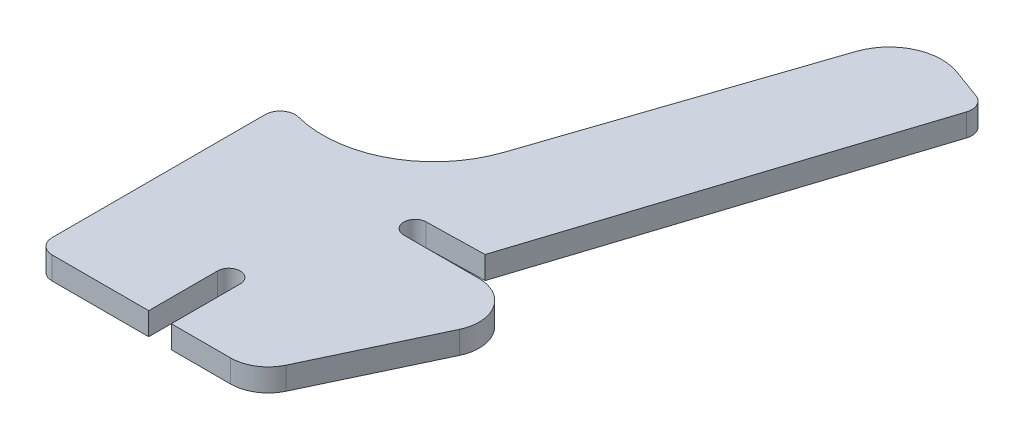
ISO-10303-21;
HEADER;
FILE_DESCRIPTION(('STEP AP214'),'2;1');
FILE_NAME('part.step','',(''),(''),'','','');
FILE_SCHEMA(('AUTOMOTIVE_DESIGN { 1 0 10303 214 1 1 1 1 }'));
ENDSEC;
DATA;
#1=APPLICATION_CONTEXT('core data for automotive mechanical design processes');
#2=APPLICATION_PROTOCOL_DEFINITION('international standard','automotive_design',2000,#1);
#3=PRODUCT_CONTEXT('',#1,'mechanical');
#4=PRODUCT('Part','Part','',(#3));
#5=PRODUCT_RELATED_PRODUCT_CATEGORY('part','',(#4));
#6=PRODUCT_DEFINITION_FORMATION('','',#4);
#7=PRODUCT_DEFINITION_CONTEXT('part definition',#1,'design');
#8=PRODUCT_DEFINITION('design','',#6,#7);
#9=PRODUCT_DEFINITION_SHAPE('','',#8);
#10=(LENGTH_UNIT() NAMED_UNIT(*) SI_UNIT(.MILLI.,.METRE.));
#11=(NAMED_UNIT(*) PLANE_ANGLE_UNIT() SI_UNIT($,.RADIAN.));
#12=(NAMED_UNIT(*) SI_UNIT($,.STERADIAN.) SOLID_ANGLE_UNIT());
#13=UNCERTAINTY_MEASURE_WITH_UNIT(LENGTH_MEASURE(1.E-05),#10,'distance_accuracy_value','');
#14=(GEOMETRIC_REPRESENTATION_CONTEXT(3) GLOBAL_UNCERTAINTY_ASSIGNED_CONTEXT((#13)) GLOBAL_UNIT_ASSIGNED_CONTEXT((#10,
#11,#12)) REPRESENTATION_CONTEXT('',''));
#15=CARTESIAN_POINT('',(0.,0.,0.));
#16=DIRECTION('',(0.,0.,1.));
#17=DIRECTION('',(1.,0.,0.));
#18=AXIS2_PLACEMENT_3D('',#15,#16,#17);
#19=CARTESIAN_POINT('',(0.,3.,0.));
#20=DIRECTION('',(0.,0.,-1.));
#21=DIRECTION('',(-1.,0.,0.));
#22=AXIS2_PLACEMENT_3D('',#19,#20,#21);
#23=PLANE('',#22);
#24=DIRECTION('',(1.,0.,0.));
#25=VECTOR('',#24,1.);
#26=CARTESIAN_POINT('',(0.,3.,0.));
#27=LINE('',#26,#25);
#28=CARTESIAN_POINT('',(2.,3.,0.));
#29=VERTEX_POINT('',#28);
#30=CARTESIAN_POINT('',(14.8,3.,0.));
#31=VERTEX_POINT('',#30);
#32=EDGE_CURVE('E169',#29,#31,#27,.T.);
#33=ORIENTED_EDGE('',*,*,#32,.F.);
#34=DIRECTION('',(0.,-1.,0.));
#35=VECTOR('',#34,1.);
#36=CARTESIAN_POINT('',(2.,3.,0.));
#37=LINE('',#36,#35);
#38=CARTESIAN_POINT('',(2.,0.,0.));
#39=VERTEX_POINT('',#38);
#40=EDGE_CURVE('E231',#29,#39,#37,.T.);
#41=ORIENTED_EDGE('',*,*,#40,.T.);
#42=DIRECTION('',(1.,0.,0.));
#43=VECTOR('',#42,1.);
#44=CARTESIAN_POINT('',(0.,0.,0.));
#45=LINE('',#44,#43);
#46=CARTESIAN_POINT('',(14.8,0.,0.));
#47=VERTEX_POINT('',#46);
#48=EDGE_CURVE('E193',#39,#47,#45,.T.);
#49=ORIENTED_EDGE('',*,*,#48,.T.);
#50=DIRECTION('',(0.,-1.,0.));
#51=VECTOR('',#50,1.);
#52=CARTESIAN_POINT('',(14.8,3.,0.));
#53=LINE('',#52,#51);
#54=EDGE_CURVE('E186',#31,#47,#53,.T.);
#55=ORIENTED_EDGE('',*,*,#54,.F.);
#56=EDGE_LOOP('',(#33,#41,#49,#55));
#57=FACE_BOUND('',#56,.T.);
#58=ADVANCED_FACE('F33',(#57),#23,.F.);
#59=CARTESIAN_POINT('',(14.8,3.,0.));
#60=DIRECTION('',(-1.,0.,0.));
#61=DIRECTION('',(0.,0.,1.));
#62=AXIS2_PLACEMENT_3D('',#59,#60,#61);
#63=PLANE('',#62);
#64=DIRECTION('',(0.,0.,-1.));
#65=VECTOR('',#64,1.);
#66=CARTESIAN_POINT('',(14.8,0.,0.));
#67=LINE('',#66,#65);
#68=CARTESIAN_POINT('',(14.8,0.,-9.13));
#69=VERTEX_POINT('',#68);
#70=EDGE_CURVE('E311',#47,#69,#67,.T.);
#71=ORIENTED_EDGE('',*,*,#70,.T.);
#72=DIRECTION('',(0.,-1.,0.));
#73=VECTOR('',#72,1.);
#74=CARTESIAN_POINT('',(14.8,3.,-9.13));
#75=LINE('',#74,#73);
#76=CARTESIAN_POINT('',(14.8,3.,-9.13));
#77=VERTEX_POINT('',#76);
#78=EDGE_CURVE('E188',#77,#69,#75,.T.);
#79=ORIENTED_EDGE('',*,*,#78,.F.);
#80=DIRECTION('',(0.,0.,-1.));
#81=VECTOR('',#80,1.);
#82=CARTESIAN_POINT('',(14.8,3.,0.));
#83=LINE('',#82,#81);
#84=EDGE_CURVE('E172',#31,#77,#83,.T.);
#85=ORIENTED_EDGE('',*,*,#84,.F.);
#86=ORIENTED_EDGE('',*,*,#54,.T.);
#87=EDGE_LOOP('',(#71,#79,#85,#86));
#88=FACE_BOUND('',#87,.T.);
#89=ADVANCED_FACE('F185',(#88),#63,.F.);
#90=CARTESIAN_POINT('',(16.3,3.,-9.13));
#91=DIRECTION('',(0.,-1.,0.));
#92=DIRECTION('',(0.,0.,-1.));
#93=AXIS2_PLACEMENT_3D('',#90,#91,#92);
#94=CYLINDRICAL_SURFACE('',#93,1.5);
#95=CARTESIAN_POINT('',(16.3,0.,-9.13));
#96=DIRECTION('',(0.,-1.,0.));
#97=DIRECTION('',(0.,0.,-1.));
#98=AXIS2_PLACEMENT_3D('',#95,#96,#97);
#99=CIRCLE('',#98,1.5);
#100=CARTESIAN_POINT('',(17.8,0.,-9.13));
#101=VERTEX_POINT('',#100);
#102=EDGE_CURVE('E310',#69,#101,#99,.T.);
#103=ORIENTED_EDGE('',*,*,#102,.T.);
#104=DIRECTION('',(0.,-1.,0.));
#105=VECTOR('',#104,1.);
#106=CARTESIAN_POINT('',(17.8,3.,-9.13));
#107=LINE('',#106,#105);
#108=CARTESIAN_POINT('',(17.8,3.,-9.13));
#109=VERTEX_POINT('',#108);
#110=EDGE_CURVE('E200',#109,#101,#107,.T.);
#111=ORIENTED_EDGE('',*,*,#110,.F.);
#112=CARTESIAN_POINT('',(16.3,3.,-9.13));
#113=DIRECTION('',(0.,-1.,0.));
#114=DIRECTION('',(0.,0.,-1.));
#115=AXIS2_PLACEMENT_3D('',#112,#113,#114);
#116=CIRCLE('',#115,1.5);
#117=EDGE_CURVE('E190',#77,#109,#116,.T.);
#118=ORIENTED_EDGE('',*,*,#117,.F.);
#119=ORIENTED_EDGE('',*,*,#78,.T.);
#120=EDGE_LOOP('',(#103,#111,#118,#119));
#121=FACE_BOUND('',#120,.T.);
#122=ADVANCED_FACE('F337',(#121),#94,.F.);
#123=CARTESIAN_POINT('',(17.8,3.,-9.13));
#124=DIRECTION('',(1.,0.,0.));
#125=DIRECTION('',(0.,0.,-1.));
#126=AXIS2_PLACEMENT_3D('',#123,#124,#125);
#127=PLANE('',#126);
#128=DIRECTION('',(0.,0.,1.));
#129=VECTOR('',#128,1.);
#130=CARTESIAN_POINT('',(17.8,0.,-9.13));
#131=LINE('',#130,#129);
#132=CARTESIAN_POINT('',(17.8,0.,0.));
#133=VERTEX_POINT('',#132);
#134=EDGE_CURVE('E266',#101,#133,#131,.T.);
#135=ORIENTED_EDGE('',*,*,#134,.T.);
#136=DIRECTION('',(0.,-1.,0.));
#137=VECTOR('',#136,1.);
#138=CARTESIAN_POINT('',(17.8,3.,0.));
#139=LINE('',#138,#137);
#140=CARTESIAN_POINT('',(17.8,3.,0.));
#141=VERTEX_POINT('',#140);
#142=EDGE_CURVE('E298',#141,#133,#139,.T.);
#143=ORIENTED_EDGE('',*,*,#142,.F.);
#144=DIRECTION('',(0.,0.,1.));
#145=VECTOR('',#144,1.);
#146=CARTESIAN_POINT('',(17.8,3.,-9.13));
#147=LINE('',#146,#145);
#148=EDGE_CURVE('E307',#109,#141,#147,.T.);
#149=ORIENTED_EDGE('',*,*,#148,.F.);
#150=ORIENTED_EDGE('',*,*,#110,.T.);
#151=EDGE_LOOP('',(#135,#143,#149,#150));
#152=FACE_BOUND('',#151,.T.);
#153=ADVANCED_FACE('F305',(#152),#127,.F.);
#154=CARTESIAN_POINT('',(17.8,3.,0.));
#155=DIRECTION('',(0.,0.,-1.));
#156=DIRECTION('',(-1.,0.,0.));
#157=AXIS2_PLACEMENT_3D('',#154,#155,#156);
#158=PLANE('',#157);
#159=DIRECTION('',(1.,0.,0.));
#160=VECTOR('',#159,1.);
#161=CARTESIAN_POINT('',(17.8,0.,0.));
#162=LINE('',#161,#160);
#163=CARTESIAN_POINT('',(25.6540198927473,0.,0.));
#164=VERTEX_POINT('',#163);
#165=EDGE_CURVE('E262',#133,#164,#162,.T.);
#166=ORIENTED_EDGE('',*,*,#165,.T.);
#167=DIRECTION('',(0.,-1.,0.));
#168=VECTOR('',#167,1.);
#169=CARTESIAN_POINT('',(25.6540198927473,3.,0.));
#170=LINE('',#169,#168);
#171=CARTESIAN_POINT('',(25.6540198927473,3.,0.));
#172=VERTEX_POINT('',#171);
#173=EDGE_CURVE('E41',#164,#172,#170,.F.);
#174=ORIENTED_EDGE('',*,*,#173,.T.);
#175=DIRECTION('',(1.,0.,0.));
#176=VECTOR('',#175,1.);
#177=CARTESIAN_POINT('',(17.8,3.,0.));
#178=LINE('',#177,#176);
#179=EDGE_CURVE('E334',#141,#172,#178,.T.);
#180=ORIENTED_EDGE('',*,*,#179,.F.);
#181=ORIENTED_EDGE('',*,*,#142,.T.);
#182=EDGE_LOOP('',(#166,#174,#180,#181));
#183=FACE_BOUND('',#182,.T.);
#184=ADVANCED_FACE('F344',(#183),#158,.F.);
#185=CARTESIAN_POINT('',(28.82,3.,0.));
#186=DIRECTION('',(-0.903960606850971,0.,-0.427615740193956));
#187=DIRECTION('',(-0.427615740193956,0.,0.903960606850971));
#188=AXIS2_PLACEMENT_3D('',#185,#186,#187);
#189=PLANE('',#188);
#190=DIRECTION('',(0.427615740193956,0.,-0.903960606850971));
#191=VECTOR('',#190,1.);
#192=CARTESIAN_POINT('',(28.82,3.,0.));
#193=LINE('',#192,#191);
#194=CARTESIAN_POINT('',(30.1738229270022,3.,-2.86192129903022));
#195=VERTEX_POINT('',#194);
#196=CARTESIAN_POINT('',(37.5533541770022,3.,-18.4619212990302));
#197=VERTEX_POINT('',#196);
#198=EDGE_CURVE('E255',#195,#197,#193,.T.);
#199=ORIENTED_EDGE('',*,*,#198,.F.);
#200=DIRECTION('',(0.,-1.,0.));
#201=VECTOR('',#200,1.);
#202=CARTESIAN_POINT('',(30.1738229270022,3.,-2.86192129903022));
#203=LINE('',#202,#201);
#204=CARTESIAN_POINT('',(30.1738229270022,0.,-2.86192129903022));
#205=VERTEX_POINT('',#204);
#206=EDGE_CURVE('E247',#195,#205,#203,.T.);
#207=ORIENTED_EDGE('',*,*,#206,.T.);
#208=DIRECTION('',(0.427615740193956,0.,-0.903960606850971));
#209=VECTOR('',#208,1.);
#210=CARTESIAN_POINT('',(28.82,0.,0.));
#211=LINE('',#210,#209);
#212=CARTESIAN_POINT('',(37.5533541770022,0.,-18.4619212990302));
#213=VERTEX_POINT('',#212);
#214=EDGE_CURVE('E254',#205,#213,#211,.T.);
#215=ORIENTED_EDGE('',*,*,#214,.T.);
#216=DIRECTION('',(0.,-1.,0.));
#217=VECTOR('',#216,1.);
#218=CARTESIAN_POINT('',(37.5533541770022,3.,-18.4619212990302));
#219=LINE('',#218,#217);
#220=EDGE_CURVE('E206',#213,#197,#219,.F.);
#221=ORIENTED_EDGE('',*,*,#220,.T.);
#222=EDGE_LOOP('',(#199,#207,#215,#221));
#223=FACE_BOUND('',#222,.T.);
#224=ADVANCED_FACE('F253',(#223),#189,.F.);
#225=CARTESIAN_POINT('',(40.93,3.,-25.6));
#226=DIRECTION('',(0.,0.,1.));
#227=DIRECTION('',(1.,0.,0.));
#228=AXIS2_PLACEMENT_3D('',#225,#226,#227);
#229=PLANE('',#228);
#230=DIRECTION('',(-1.,0.,0.));
#231=VECTOR('',#230,1.);
#232=CARTESIAN_POINT('',(40.93,3.,-25.6));
#233=LINE('',#232,#231);
#234=CARTESIAN_POINT('',(33.0335511427473,3.,-25.6));
#235=VERTEX_POINT('',#234);
#236=CARTESIAN_POINT('',(23.0399152688008,3.,-25.6));
#237=VERTEX_POINT('',#236);
#238=EDGE_CURVE('E331',#235,#237,#233,.T.);
#239=ORIENTED_EDGE('',*,*,#238,.F.);
#240=DIRECTION('',(0.,-1.,0.));
#241=VECTOR('',#240,1.);
#242=CARTESIAN_POINT('',(33.0335511427473,3.,-25.6));
#243=LINE('',#242,#241);
#244=CARTESIAN_POINT('',(33.0335511427473,0.,-25.6));
#245=VERTEX_POINT('',#244);
#246=EDGE_CURVE('E195',#235,#245,#243,.T.);
#247=ORIENTED_EDGE('',*,*,#246,.T.);
#248=DIRECTION('',(-1.,0.,0.));
#249=VECTOR('',#248,1.);
#250=CARTESIAN_POINT('',(40.93,0.,-25.6));
#251=LINE('',#250,#249);
#252=CARTESIAN_POINT('',(23.0399152688008,0.,-25.6));
#253=VERTEX_POINT('',#252);
#254=EDGE_CURVE('E261',#245,#253,#251,.T.);
#255=ORIENTED_EDGE('',*,*,#254,.T.);
#256=DIRECTION('',(0.,-1.,0.));
#257=VECTOR('',#256,1.);
#258=CARTESIAN_POINT('',(23.0399152688008,3.,-25.6));
#259=LINE('',#258,#257);
#260=EDGE_CURVE('E295',#237,#253,#259,.T.);
#261=ORIENTED_EDGE('',*,*,#260,.F.);
#262=EDGE_LOOP('',(#239,#247,#255,#261));
#263=FACE_BOUND('',#262,.T.);
#264=ADVANCED_FACE('F417',(#263),#229,.F.);
#265=CARTESIAN_POINT('',(23.0399152688008,3.,-27.1));
#266=DIRECTION('',(0.,-1.,0.));
#267=DIRECTION('',(0.,0.,-1.));
#268=AXIS2_PLACEMENT_3D('',#265,#266,#267);
#269=CYLINDRICAL_SURFACE('',#268,1.5);
#270=CARTESIAN_POINT('',(23.0399152688008,0.,-27.1));
#271=DIRECTION('',(0.,-1.,0.));
#272=DIRECTION('',(0.,0.,-1.));
#273=AXIS2_PLACEMENT_3D('',#270,#271,#272);
#274=CIRCLE('',#273,1.5);
#275=CARTESIAN_POINT('',(23.0080306203165,0.,-28.5996610847758));
#276=VERTEX_POINT('',#275);
#277=EDGE_CURVE('E264',#253,#276,#274,.T.);
#278=ORIENTED_EDGE('',*,*,#277,.T.);
#279=DIRECTION('',(0.,-1.,0.));
#280=VECTOR('',#279,1.);
#281=CARTESIAN_POINT('',(23.0080306203165,3.,-28.5996610847758));
#282=LINE('',#281,#280);
#283=CARTESIAN_POINT('',(23.0080306203165,3.,-28.5996610847758));
#284=VERTEX_POINT('',#283);
#285=EDGE_CURVE('E292',#284,#276,#282,.T.);
#286=ORIENTED_EDGE('',*,*,#285,.F.);
#287=CARTESIAN_POINT('',(23.0399152688008,3.,-27.1));
#288=DIRECTION('',(0.,-1.,0.));
#289=DIRECTION('',(0.,0.,-1.));
#290=AXIS2_PLACEMENT_3D('',#287,#288,#289);
#291=CIRCLE('',#290,1.5);
#292=EDGE_CURVE('E329',#237,#284,#291,.T.);
#293=ORIENTED_EDGE('',*,*,#292,.F.);
#294=ORIENTED_EDGE('',*,*,#260,.T.);
#295=EDGE_LOOP('',(#278,#286,#293,#294));
#296=FACE_BOUND('',#295,.T.);
#297=ADVANCED_FACE('F412',(#296),#269,.F.);
#298=CARTESIAN_POINT('',(23.0080306203165,3.,-28.5996610847758));
#299=DIRECTION('',(-0.0212564323228623,0.,-0.999774056517223));
#300=DIRECTION('',(-0.999774056517223,0.,0.0212564323228623));
#301=AXIS2_PLACEMENT_3D('',#298,#299,#300);
#302=PLANE('',#301);
#303=DIRECTION('',(0.999774056517223,0.,-0.0212564323228623));
#304=VECTOR('',#303,1.);
#305=CARTESIAN_POINT('',(23.0080306203165,0.,-28.5996610847758));
#306=LINE('',#305,#304);
#307=CARTESIAN_POINT('',(30.66,0.,-28.762351412851));
#308=VERTEX_POINT('',#307);
#309=EDGE_CURVE('E271',#276,#308,#306,.T.);
#310=ORIENTED_EDGE('',*,*,#309,.T.);
#311=DIRECTION('',(0.,-1.,0.));
#312=VECTOR('',#311,1.);
#313=CARTESIAN_POINT('',(30.66,3.,-28.762351412851));
#314=LINE('',#313,#312);
#315=CARTESIAN_POINT('',(30.66,3.,-28.762351412851));
#316=VERTEX_POINT('',#315);
#317=EDGE_CURVE('E288',#316,#308,#314,.T.);
#318=ORIENTED_EDGE('',*,*,#317,.F.);
#319=DIRECTION('',(0.999774056517223,0.,-0.0212564323228623));
#320=VECTOR('',#319,1.);
#321=CARTESIAN_POINT('',(23.0080306203165,3.,-28.5996610847758));
#322=LINE('',#321,#320);
#323=EDGE_CURVE('E327',#284,#316,#322,.T.);
#324=ORIENTED_EDGE('',*,*,#323,.F.);
#325=ORIENTED_EDGE('',*,*,#285,.T.);
#326=EDGE_LOOP('',(#310,#318,#324,#325));
#327=FACE_BOUND('',#326,.T.);
#328=ADVANCED_FACE('F408',(#327),#302,.F.);
#329=CARTESIAN_POINT('',(30.66,3.,-28.762351412851));
#330=DIRECTION('',(-0.95194927980792,0.,-0.306255724310881));
#331=DIRECTION('',(-0.306255724310881,0.,0.95194927980792));
#332=AXIS2_PLACEMENT_3D('',#329,#330,#331);
#333=PLANE('',#332);
#334=DIRECTION('',(0.306255724310881,0.,-0.95194927980792));
#335=VECTOR('',#334,1.);
#336=CARTESIAN_POINT('',(30.66,0.,-28.762351412851));
#337=LINE('',#336,#335);
#338=CARTESIAN_POINT('',(46.2006174089711,0.,-77.0679939719535));
#339=VERTEX_POINT('',#338);
#340=EDGE_CURVE('E273',#308,#339,#337,.T.);
#341=ORIENTED_EDGE('',*,*,#340,.T.);
#342=DIRECTION('',(0.,-1.,0.));
#343=VECTOR('',#342,1.);
#344=CARTESIAN_POINT('',(46.2006174089711,3.,-77.0679939719535));
#345=LINE('',#344,#343);
#346=CARTESIAN_POINT('',(46.2006174089711,3.,-77.0679939719535));
#347=VERTEX_POINT('',#346);
#348=EDGE_CURVE('E245',#339,#347,#345,.F.);
#349=ORIENTED_EDGE('',*,*,#348,.T.);
#350=DIRECTION('',(0.306255724310881,0.,-0.95194927980792));
#351=VECTOR('',#350,1.);
#352=CARTESIAN_POINT('',(30.66,3.,-28.762351412851));
#353=LINE('',#352,#351);
#354=EDGE_CURVE('E324',#316,#347,#353,.T.);
#355=ORIENTED_EDGE('',*,*,#354,.F.);
#356=ORIENTED_EDGE('',*,*,#317,.T.);
#357=EDGE_LOOP('',(#341,#349,#355,#356));
#358=FACE_BOUND('',#357,.T.);
#359=ADVANCED_FACE('F404',(#358),#333,.F.);
#360=CARTESIAN_POINT('',(46.79,3.,-78.9));
#361=DIRECTION('',(-0.34265342494036,0.,0.939461883408071));
#362=DIRECTION('',(0.939461883408072,0.,0.34265342494036));
#363=AXIS2_PLACEMENT_3D('',#360,#361,#362);
#364=PLANE('',#363);
#365=DIRECTION('',(-0.939461883408072,0.,-0.34265342494036));
#366=VECTOR('',#365,1.);
#367=CARTESIAN_POINT('',(46.79,3.,-78.9));
#368=LINE('',#367,#366);
#369=CARTESIAN_POINT('',(44.982025699236,3.,-79.5594291873914));
#370=VERTEX_POINT('',#369);
#371=CARTESIAN_POINT('',(40.9625663933564,3.,-81.0254615213182));
#372=VERTEX_POINT('',#371);
#373=EDGE_CURVE('E322',#370,#372,#368,.T.);
#374=ORIENTED_EDGE('',*,*,#373,.F.);
#375=DIRECTION('',(0.,-1.,0.));
#376=VECTOR('',#375,1.);
#377=CARTESIAN_POINT('',(44.982025699236,3.,-79.5594291873914));
#378=LINE('',#377,#376);
#379=CARTESIAN_POINT('',(44.982025699236,0.,-79.5594291873914));
#380=VERTEX_POINT('',#379);
#381=EDGE_CURVE('E242',#370,#380,#378,.T.);
#382=ORIENTED_EDGE('',*,*,#381,.T.);
#383=DIRECTION('',(-0.939461883408072,0.,-0.34265342494036));
#384=VECTOR('',#383,1.);
#385=CARTESIAN_POINT('',(46.79,0.,-78.9));
#386=LINE('',#385,#384);
#387=CARTESIAN_POINT('',(40.9625663933564,0.,-81.0254615213182));
#388=VERTEX_POINT('',#387);
#389=EDGE_CURVE('E276',#380,#388,#386,.T.);
#390=ORIENTED_EDGE('',*,*,#389,.T.);
#391=DIRECTION('',(0.,-1.,0.));
#392=VECTOR('',#391,1.);
#393=CARTESIAN_POINT('',(40.9625663933564,3.,-81.0254615213182));
#394=LINE('',#393,#392);
#395=EDGE_CURVE('E226',#388,#372,#394,.F.);
#396=ORIENTED_EDGE('',*,*,#395,.T.);
#397=EDGE_LOOP('',(#374,#382,#390,#396));
#398=FACE_BOUND('',#397,.T.);
#399=ADVANCED_FACE('F379',(#398),#364,.F.);
#400=CARTESIAN_POINT('',(34.22,3.,-83.484702825702));
#401=DIRECTION('',(0.947726073371174,0.,0.31908508246619));
#402=DIRECTION('',(0.31908508246619,0.,-0.947726073371174));
#403=AXIS2_PLACEMENT_3D('',#400,#401,#402);
#404=PLANE('',#403);
#405=DIRECTION('',(-0.31908508246619,0.,0.947726073371174));
#406=VECTOR('',#405,1.);
#407=CARTESIAN_POINT('',(34.22,3.,-83.484702825702));
#408=LINE('',#407,#406);
#409=CARTESIAN_POINT('',(31.9299099051756,3.,-76.6828239147251));
#410=VERTEX_POINT('',#409);
#411=CARTESIAN_POINT('',(20.1713543051416,3.,-41.7583152501195));
#412=VERTEX_POINT('',#411);
#413=EDGE_CURVE('E320',#410,#412,#408,.T.);
#414=ORIENTED_EDGE('',*,*,#413,.F.);
#415=DIRECTION('',(0.,-1.,0.));
#416=VECTOR('',#415,1.);
#417=CARTESIAN_POINT('',(31.9299099051756,3.,-76.6828239147251));
#418=LINE('',#417,#416);
#419=CARTESIAN_POINT('',(31.9299099051756,0.,-76.6828239147251));
#420=VERTEX_POINT('',#419);
#421=EDGE_CURVE('E220',#410,#420,#418,.T.);
#422=ORIENTED_EDGE('',*,*,#421,.T.);
#423=DIRECTION('',(-0.31908508246619,0.,0.947726073371174));
#424=VECTOR('',#423,1.);
#425=CARTESIAN_POINT('',(34.22,0.,-83.484702825702));
#426=LINE('',#425,#424);
#427=CARTESIAN_POINT('',(20.1713543051416,0.,-41.7583152501195));
#428=VERTEX_POINT('',#427);
#429=EDGE_CURVE('E278',#420,#428,#426,.T.);
#430=ORIENTED_EDGE('',*,*,#429,.T.);
#431=DIRECTION('',(0.,-1.,0.));
#432=VECTOR('',#431,1.);
#433=CARTESIAN_POINT('',(20.1713543051416,3.,-41.7583152501195));
#434=LINE('',#433,#432);
#435=EDGE_CURVE('E285',#412,#428,#434,.T.);
#436=ORIENTED_EDGE('',*,*,#435,.F.);
#437=EDGE_LOOP('',(#414,#422,#430,#436));
#438=FACE_BOUND('',#437,.T.);
#439=ADVANCED_FACE('F387',(#438),#404,.F.);
#440=CARTESIAN_POINT('',(6.17869455636933,3.,-46.46943285605));
#441=DIRECTION('',(0.,-1.,0.));
#442=DIRECTION('',(0.,0.,-1.));
#443=AXIS2_PLACEMENT_3D('',#440,#441,#442);
#444=CYLINDRICAL_SURFACE('',#443,14.7644558295191);
#445=CARTESIAN_POINT('',(6.17869455636933,0.,-46.46943285605));
#446=DIRECTION('',(0.,-1.,0.));
#447=DIRECTION('',(0.,0.,-1.));
#448=AXIS2_PLACEMENT_3D('',#445,#446,#447);
#449=CIRCLE('',#448,14.7644558295191);
#450=CARTESIAN_POINT('',(2.49851836514865,0.,-32.1709903134724));
#451=VERTEX_POINT('',#450);
#452=EDGE_CURVE('E280',#428,#451,#449,.T.);
#453=ORIENTED_EDGE('',*,*,#452,.T.);
#454=DIRECTION('',(0.,-1.,0.));
#455=VECTOR('',#454,1.);
#456=CARTESIAN_POINT('',(2.49851836514865,3.,-32.1709903134724));
#457=LINE('',#456,#455);
#458=CARTESIAN_POINT('',(2.49851836514865,3.,-32.1709903134724));
#459=VERTEX_POINT('',#458);
#460=EDGE_CURVE('E216',#451,#459,#457,.F.);
#461=ORIENTED_EDGE('',*,*,#460,.T.);
#462=CARTESIAN_POINT('',(6.17869455636933,3.,-46.46943285605));
#463=DIRECTION('',(0.,-1.,0.));
#464=DIRECTION('',(0.,0.,-1.));
#465=AXIS2_PLACEMENT_3D('',#462,#463,#464);
#466=CIRCLE('',#465,14.7644558295191);
#467=EDGE_CURVE('E317',#412,#459,#466,.T.);
#468=ORIENTED_EDGE('',*,*,#467,.F.);
#469=ORIENTED_EDGE('',*,*,#435,.T.);
#470=EDGE_LOOP('',(#453,#461,#468,#469));
#471=FACE_BOUND('',#470,.T.);
#472=ADVANCED_FACE('F392',(#471),#444,.F.);
#473=CARTESIAN_POINT('',(0.,3.,-33.06));
#474=DIRECTION('',(1.,0.,0.));
#475=DIRECTION('',(0.,0.,-1.));
#476=AXIS2_PLACEMENT_3D('',#473,#474,#475);
#477=PLANE('',#476);
#478=DIRECTION('',(0.,0.,1.));
#479=VECTOR('',#478,1.);
#480=CARTESIAN_POINT('',(0.,0.,-33.06));
#481=LINE('',#480,#479);
#482=CARTESIAN_POINT('',(0.,0.,-30.234116688372));
#483=VERTEX_POINT('',#482);
#484=CARTESIAN_POINT('',(0.,0.,-2.));
#485=VERTEX_POINT('',#484);
#486=EDGE_CURVE('E181',#483,#485,#481,.T.);
#487=ORIENTED_EDGE('',*,*,#486,.T.);
#488=DIRECTION('',(0.,-1.,0.));
#489=VECTOR('',#488,1.);
#490=CARTESIAN_POINT('',(0.,3.,-2.));
#491=LINE('',#490,#489);
#492=CARTESIAN_POINT('',(0.,3.,-2.));
#493=VERTEX_POINT('',#492);
#494=EDGE_CURVE('E237',#485,#493,#491,.F.);
#495=ORIENTED_EDGE('',*,*,#494,.T.);
#496=DIRECTION('',(0.,0.,1.));
#497=VECTOR('',#496,1.);
#498=CARTESIAN_POINT('',(0.,3.,-33.06));
#499=LINE('',#498,#497);
#500=CARTESIAN_POINT('',(0.,3.,-30.234116688372));
#501=VERTEX_POINT('',#500);
#502=EDGE_CURVE('E289',#501,#493,#499,.T.);
#503=ORIENTED_EDGE('',*,*,#502,.F.);
#504=DIRECTION('',(0.,-1.,0.));
#505=VECTOR('',#504,1.);
#506=CARTESIAN_POINT('',(0.,3.,-30.234116688372));
#507=LINE('',#506,#505);
#508=EDGE_CURVE('E211',#501,#483,#507,.T.);
#509=ORIENTED_EDGE('',*,*,#508,.T.);
#510=EDGE_LOOP('',(#487,#495,#503,#509));
#511=FACE_BOUND('',#510,.T.);
#512=ADVANCED_FACE('F399',(#511),#477,.F.);
#513=CARTESIAN_POINT('',(16.3,3.,-9.13));
#514=DIRECTION('',(0.,-1.,0.));
#515=DIRECTION('',(0.,0.,-1.));
#516=AXIS2_PLACEMENT_3D('',#513,#514,#515);
#517=PLANE('',#516);
#518=ORIENTED_EDGE('',*,*,#179,.T.);
#519=CARTESIAN_POINT('',(25.6540198927473,3.,-5.));
#520=DIRECTION('',(0.,-1.,0.));
#521=DIRECTION('',(0.,0.,-1.));
#522=AXIS2_PLACEMENT_3D('',#519,#520,#521);
#523=CIRCLE('',#522,5.);
#524=EDGE_CURVE('E11',#172,#195,#523,.F.);
#525=ORIENTED_EDGE('',*,*,#524,.T.);
#526=ORIENTED_EDGE('',*,*,#198,.T.);
#527=CARTESIAN_POINT('',(33.0335511427473,3.,-20.6));
#528=DIRECTION('',(0.,-1.,0.));
#529=DIRECTION('',(0.,0.,-1.));
#530=AXIS2_PLACEMENT_3D('',#527,#528,#529);
#531=CIRCLE('',#530,5.);
#532=EDGE_CURVE('E209',#197,#235,#531,.F.);
#533=ORIENTED_EDGE('',*,*,#532,.T.);
#534=ORIENTED_EDGE('',*,*,#238,.T.);
#535=ORIENTED_EDGE('',*,*,#292,.T.);
#536=ORIENTED_EDGE('',*,*,#323,.T.);
#537=ORIENTED_EDGE('',*,*,#354,.T.);
#538=CARTESIAN_POINT('',(44.2967188493552,3.,-77.6805054205752));
#539=DIRECTION('',(0.,-1.,0.));
#540=DIRECTION('',(0.,0.,-1.));
#541=AXIS2_PLACEMENT_3D('',#538,#539,#540);
#542=CIRCLE('',#541,2.);
#543=EDGE_CURVE('E239',#347,#370,#542,.F.);
#544=ORIENTED_EDGE('',*,*,#543,.T.);
#545=ORIENTED_EDGE('',*,*,#373,.T.);
#546=CARTESIAN_POINT('',(38.5639924187738,3.,-74.4492283374617));
#547=DIRECTION('',(0.,-1.,0.));
#548=DIRECTION('',(0.,0.,-1.));
#549=AXIS2_PLACEMENT_3D('',#546,#547,#548);
#550=CIRCLE('',#549,7.);
#551=EDGE_CURVE('E229',#372,#410,#550,.F.);
#552=ORIENTED_EDGE('',*,*,#551,.T.);
#553=ORIENTED_EDGE('',*,*,#413,.T.);
#554=ORIENTED_EDGE('',*,*,#467,.T.);
#555=CARTESIAN_POINT('',(2.,3.,-30.234116688372));
#556=DIRECTION('',(0.,-1.,0.));
#557=DIRECTION('',(0.,0.,-1.));
#558=AXIS2_PLACEMENT_3D('',#555,#556,#557);
#559=CIRCLE('',#558,2.);
#560=EDGE_CURVE('E218',#459,#501,#559,.F.);
#561=ORIENTED_EDGE('',*,*,#560,.T.);
#562=ORIENTED_EDGE('',*,*,#502,.T.);
#563=CARTESIAN_POINT('',(2.,3.,-2.));
#564=DIRECTION('',(0.,-1.,0.));
#565=DIRECTION('',(0.,0.,-1.));
#566=AXIS2_PLACEMENT_3D('',#563,#564,#565);
#567=CIRCLE('',#566,2.);
#568=EDGE_CURVE('E176',#493,#29,#567,.F.);
#569=ORIENTED_EDGE('',*,*,#568,.T.);
#570=ORIENTED_EDGE('',*,*,#32,.T.);
#571=ORIENTED_EDGE('',*,*,#84,.T.);
#572=ORIENTED_EDGE('',*,*,#117,.T.);
#573=ORIENTED_EDGE('',*,*,#148,.T.);
#574=EDGE_LOOP('',(#518,#525,#526,#533,#534,#535,#536,#537,#544,#545,#552,#553,#554,#561,#562,
#569,#570,#571,#572,#573));
#575=FACE_BOUND('',#574,.T.);
#576=ADVANCED_FACE('F171',(#575),#517,.F.);
#577=CARTESIAN_POINT('',(16.3,0.,-9.13));
#578=DIRECTION('',(0.,-1.,0.));
#579=DIRECTION('',(0.,0.,-1.));
#580=AXIS2_PLACEMENT_3D('',#577,#578,#579);
#581=PLANE('',#580);
#582=ORIENTED_EDGE('',*,*,#214,.F.);
#583=CARTESIAN_POINT('',(25.6540198927473,0.,-5.));
#584=DIRECTION('',(0.,-1.,0.));
#585=DIRECTION('',(0.,0.,-1.));
#586=AXIS2_PLACEMENT_3D('',#583,#584,#585);
#587=CIRCLE('',#586,5.);
#588=EDGE_CURVE('E55',#205,#164,#587,.T.);
#589=ORIENTED_EDGE('',*,*,#588,.T.);
#590=ORIENTED_EDGE('',*,*,#165,.F.);
#591=ORIENTED_EDGE('',*,*,#134,.F.);
#592=ORIENTED_EDGE('',*,*,#102,.F.);
#593=ORIENTED_EDGE('',*,*,#70,.F.);
#594=ORIENTED_EDGE('',*,*,#48,.F.);
#595=CARTESIAN_POINT('',(2.,0.,-2.));
#596=DIRECTION('',(0.,-1.,0.));
#597=DIRECTION('',(0.,0.,-1.));
#598=AXIS2_PLACEMENT_3D('',#595,#596,#597);
#599=CIRCLE('',#598,2.);
#600=EDGE_CURVE('E235',#39,#485,#599,.T.);
#601=ORIENTED_EDGE('',*,*,#600,.T.);
#602=ORIENTED_EDGE('',*,*,#486,.F.);
#603=CARTESIAN_POINT('',(2.,0.,-30.234116688372));
#604=DIRECTION('',(0.,-1.,0.));
#605=DIRECTION('',(0.,0.,-1.));
#606=AXIS2_PLACEMENT_3D('',#603,#604,#605);
#607=CIRCLE('',#606,2.);
#608=EDGE_CURVE('E214',#483,#451,#607,.T.);
#609=ORIENTED_EDGE('',*,*,#608,.T.);
#610=ORIENTED_EDGE('',*,*,#452,.F.);
#611=ORIENTED_EDGE('',*,*,#429,.F.);
#612=CARTESIAN_POINT('',(38.5639924187738,0.,-74.4492283374617));
#613=DIRECTION('',(0.,-1.,0.));
#614=DIRECTION('',(0.,0.,-1.));
#615=AXIS2_PLACEMENT_3D('',#612,#613,#614);
#616=CIRCLE('',#615,7.);
#617=EDGE_CURVE('E223',#420,#388,#616,.T.);
#618=ORIENTED_EDGE('',*,*,#617,.T.);
#619=ORIENTED_EDGE('',*,*,#389,.F.);
#620=CARTESIAN_POINT('',(44.2967188493552,0.,-77.6805054205752));
#621=DIRECTION('',(0.,-1.,0.));
#622=DIRECTION('',(0.,0.,-1.));
#623=AXIS2_PLACEMENT_3D('',#620,#621,#622);
#624=CIRCLE('',#623,2.);
#625=EDGE_CURVE('E233',#380,#339,#624,.T.);
#626=ORIENTED_EDGE('',*,*,#625,.T.);
#627=ORIENTED_EDGE('',*,*,#340,.F.);
#628=ORIENTED_EDGE('',*,*,#309,.F.);
#629=ORIENTED_EDGE('',*,*,#277,.F.);
#630=ORIENTED_EDGE('',*,*,#254,.F.);
#631=CARTESIAN_POINT('',(33.0335511427473,0.,-20.6));
#632=DIRECTION('',(0.,-1.,0.));
#633=DIRECTION('',(0.,0.,-1.));
#634=AXIS2_PLACEMENT_3D('',#631,#632,#633);
#635=CIRCLE('',#634,5.);
#636=EDGE_CURVE('E198',#245,#213,#635,.T.);
#637=ORIENTED_EDGE('',*,*,#636,.T.);
#638=EDGE_LOOP('',(#582,#589,#590,#591,#592,#593,#594,#601,#602,#609,#610,#611,#618,#619,#626,
#627,#628,#629,#630,#637));
#639=FACE_BOUND('',#638,.T.);
#640=ADVANCED_FACE('F258',(#639),#581,.T.);
#641=CARTESIAN_POINT('',(33.0335511427473,3.,-20.6));
#642=DIRECTION('',(0.,-1.,0.));
#643=DIRECTION('',(0.,0.,-1.));
#644=AXIS2_PLACEMENT_3D('',#641,#642,#643);
#645=CYLINDRICAL_SURFACE('',#644,5.);
#646=ORIENTED_EDGE('',*,*,#532,.F.);
#647=ORIENTED_EDGE('',*,*,#220,.F.);
#648=ORIENTED_EDGE('',*,*,#636,.F.);
#649=ORIENTED_EDGE('',*,*,#246,.F.);
#650=EDGE_LOOP('',(#646,#647,#648,#649));
#651=FACE_BOUND('',#650,.T.);
#652=ADVANCED_FACE('F352',(#651),#645,.T.);
#653=CARTESIAN_POINT('',(2.,3.,-30.234116688372));
#654=DIRECTION('',(0.,-1.,0.));
#655=DIRECTION('',(0.,0.,-1.));
#656=AXIS2_PLACEMENT_3D('',#653,#654,#655);
#657=CYLINDRICAL_SURFACE('',#656,2.);
#658=ORIENTED_EDGE('',*,*,#560,.F.);
#659=ORIENTED_EDGE('',*,*,#460,.F.);
#660=ORIENTED_EDGE('',*,*,#608,.F.);
#661=ORIENTED_EDGE('',*,*,#508,.F.);
#662=EDGE_LOOP('',(#658,#659,#660,#661));
#663=FACE_BOUND('',#662,.T.);
#664=ADVANCED_FACE('F355',(#663),#657,.T.);
#665=CARTESIAN_POINT('',(38.5639924187738,3.,-74.4492283374617));
#666=DIRECTION('',(0.,-1.,0.));
#667=DIRECTION('',(0.,0.,-1.));
#668=AXIS2_PLACEMENT_3D('',#665,#666,#667);
#669=CYLINDRICAL_SURFACE('',#668,7.);
#670=ORIENTED_EDGE('',*,*,#551,.F.);
#671=ORIENTED_EDGE('',*,*,#395,.F.);
#672=ORIENTED_EDGE('',*,*,#617,.F.);
#673=ORIENTED_EDGE('',*,*,#421,.F.);
#674=EDGE_LOOP('',(#670,#671,#672,#673));
#675=FACE_BOUND('',#674,.T.);
#676=ADVANCED_FACE('F359',(#675),#669,.T.);
#677=CARTESIAN_POINT('',(2.,3.,-2.));
#678=DIRECTION('',(0.,-1.,0.));
#679=DIRECTION('',(0.,0.,-1.));
#680=AXIS2_PLACEMENT_3D('',#677,#678,#679);
#681=CYLINDRICAL_SURFACE('',#680,2.);
#682=ORIENTED_EDGE('',*,*,#568,.F.);
#683=ORIENTED_EDGE('',*,*,#494,.F.);
#684=ORIENTED_EDGE('',*,*,#600,.F.);
#685=ORIENTED_EDGE('',*,*,#40,.F.);
#686=EDGE_LOOP('',(#682,#683,#684,#685));
#687=FACE_BOUND('',#686,.T.);
#688=ADVANCED_FACE('F363',(#687),#681,.T.);
#689=CARTESIAN_POINT('',(44.2967188493552,3.,-77.6805054205752));
#690=DIRECTION('',(0.,-1.,0.));
#691=DIRECTION('',(0.,0.,-1.));
#692=AXIS2_PLACEMENT_3D('',#689,#690,#691);
#693=CYLINDRICAL_SURFACE('',#692,2.);
#694=ORIENTED_EDGE('',*,*,#543,.F.);
#695=ORIENTED_EDGE('',*,*,#348,.F.);
#696=ORIENTED_EDGE('',*,*,#625,.F.);
#697=ORIENTED_EDGE('',*,*,#381,.F.);
#698=EDGE_LOOP('',(#694,#695,#696,#697));
#699=FACE_BOUND('',#698,.T.);
#700=ADVANCED_FACE('F366',(#699),#693,.T.);
#701=CARTESIAN_POINT('',(25.6540198927473,3.,-5.));
#702=DIRECTION('',(0.,-1.,0.));
#703=DIRECTION('',(0.,0.,-1.));
#704=AXIS2_PLACEMENT_3D('',#701,#702,#703);
#705=CYLINDRICAL_SURFACE('',#704,5.);
#706=ORIENTED_EDGE('',*,*,#524,.F.);
#707=ORIENTED_EDGE('',*,*,#173,.F.);
#708=ORIENTED_EDGE('',*,*,#588,.F.);
#709=ORIENTED_EDGE('',*,*,#206,.F.);
#710=EDGE_LOOP('',(#706,#707,#708,#709));
#711=FACE_BOUND('',#710,.T.);
#712=ADVANCED_FACE('F35',(#711),#705,.T.);
#713=CLOSED_SHELL('',(#58,#89,#122,#153,#184,#224,#264,#297,#328,#359,#399,#439,#472,#512,#576,
#640,#652,#664,#676,#688,#700,#712));
#714=MANIFOLD_SOLID_BREP('B2',#713);
#715=ADVANCED_BREP_SHAPE_REPRESENTATION('',(#18,#714),#14);
#716=SHAPE_DEFINITION_REPRESENTATION(#9,#715);
ENDSEC;
END-ISO-10303-21;
